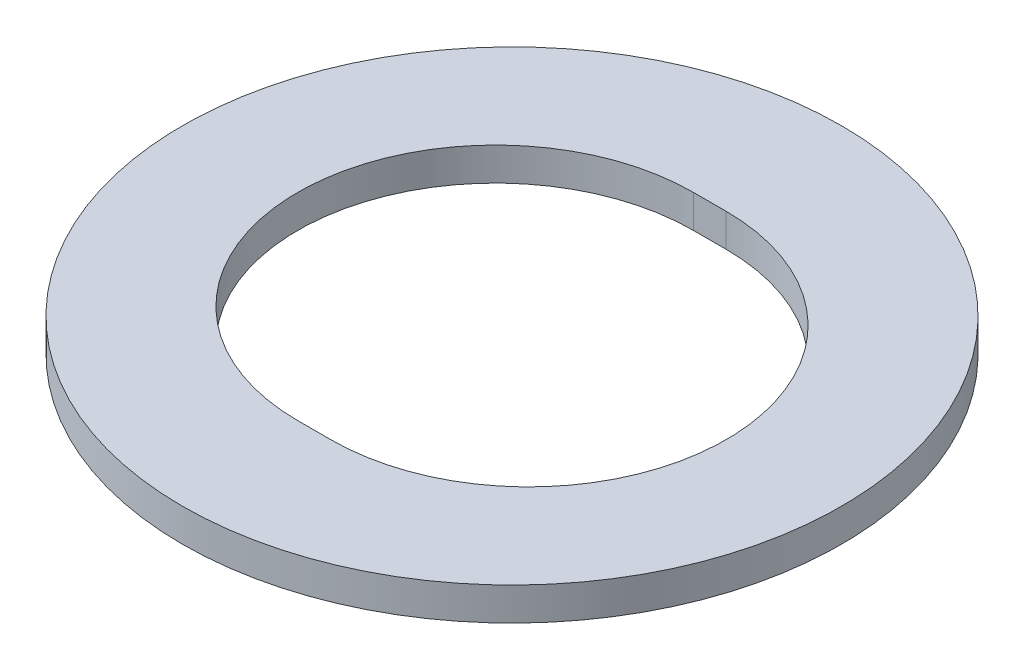
ISO-10303-21;
HEADER;
FILE_DESCRIPTION(('STEP AP214'),'2;1');
FILE_NAME('part.step','',(''),(''),'','','');
FILE_SCHEMA(('AUTOMOTIVE_DESIGN { 1 0 10303 214 1 1 1 1 }'));
ENDSEC;
DATA;
#1=APPLICATION_CONTEXT('core data for automotive mechanical design processes');
#2=APPLICATION_PROTOCOL_DEFINITION('international standard','automotive_design',2000,#1);
#3=PRODUCT_CONTEXT('',#1,'mechanical');
#4=PRODUCT('Part','Part','',(#3));
#5=PRODUCT_RELATED_PRODUCT_CATEGORY('part','',(#4));
#6=PRODUCT_DEFINITION_FORMATION('','',#4);
#7=PRODUCT_DEFINITION_CONTEXT('part definition',#1,'design');
#8=PRODUCT_DEFINITION('design','',#6,#7);
#9=PRODUCT_DEFINITION_SHAPE('','',#8);
#10=(LENGTH_UNIT() NAMED_UNIT(*) SI_UNIT(.MILLI.,.METRE.));
#11=(NAMED_UNIT(*) PLANE_ANGLE_UNIT() SI_UNIT($,.RADIAN.));
#12=(NAMED_UNIT(*) SI_UNIT($,.STERADIAN.) SOLID_ANGLE_UNIT());
#13=UNCERTAINTY_MEASURE_WITH_UNIT(LENGTH_MEASURE(1.E-05),#10,'distance_accuracy_value','');
#14=(GEOMETRIC_REPRESENTATION_CONTEXT(3) GLOBAL_UNCERTAINTY_ASSIGNED_CONTEXT((#13)) GLOBAL_UNIT_ASSIGNED_CONTEXT((#10,
#11,#12)) REPRESENTATION_CONTEXT('',''));
#15=CARTESIAN_POINT('',(0.,0.,0.));
#16=DIRECTION('',(0.,0.,1.));
#17=DIRECTION('',(1.,0.,0.));
#18=AXIS2_PLACEMENT_3D('',#15,#16,#17);
#19=CARTESIAN_POINT('',(0.,1.,0.));
#20=DIRECTION('',(0.,1.,0.));
#21=DIRECTION('',(0.,0.,1.));
#22=AXIS2_PLACEMENT_3D('',#19,#20,#21);
#23=PLANE('',#22);
#24=CARTESIAN_POINT('',(0.,1.,0.));
#25=DIRECTION('',(0.,1.,0.));
#26=DIRECTION('',(0.,0.,1.));
#27=AXIS2_PLACEMENT_3D('',#24,#25,#26);
#28=CIRCLE('',#27,10.);
#29=CARTESIAN_POINT('',(0.,1.,10.));
#30=VERTEX_POINT('',#29);
#31=EDGE_CURVE('E11',#30,#30,#28,.T.);
#32=ORIENTED_EDGE('',*,*,#31,.T.);
#33=EDGE_LOOP('',(#32));
#34=FACE_BOUND('',#33,.T.);
#35=DIRECTION('',(1.,0.,0.));
#36=VECTOR('',#35,1.);
#37=CARTESIAN_POINT('',(-0.5,1.,6.));
#38=LINE('',#37,#36);
#39=CARTESIAN_POINT('',(-0.5,1.,6.));
#40=VERTEX_POINT('',#39);
#41=CARTESIAN_POINT('',(0.500000000000002,1.,6.));
#42=VERTEX_POINT('',#41);
#43=EDGE_CURVE('E86',#40,#42,#38,.T.);
#44=ORIENTED_EDGE('',*,*,#43,.F.);
#45=CARTESIAN_POINT('',(-0.5,1.,0.));
#46=DIRECTION('',(0.,1.,0.));
#47=DIRECTION('',(0.,0.,1.));
#48=AXIS2_PLACEMENT_3D('',#45,#46,#47);
#49=CIRCLE('',#48,6.);
#50=CARTESIAN_POINT('',(-0.5,1.,-6.));
#51=VERTEX_POINT('',#50);
#52=EDGE_CURVE('E78',#51,#40,#49,.T.);
#53=ORIENTED_EDGE('',*,*,#52,.F.);
#54=DIRECTION('',(-1.,0.,0.));
#55=VECTOR('',#54,1.);
#56=CARTESIAN_POINT('',(-0.5,1.,-6.));
#57=LINE('',#56,#55);
#58=CARTESIAN_POINT('',(0.499999999999998,1.,-6.));
#59=VERTEX_POINT('',#58);
#60=EDGE_CURVE('E99',#59,#51,#57,.T.);
#61=ORIENTED_EDGE('',*,*,#60,.F.);
#62=CARTESIAN_POINT('',(0.5,1.,0.));
#63=DIRECTION('',(0.,1.,0.));
#64=DIRECTION('',(0.,0.,1.));
#65=AXIS2_PLACEMENT_3D('',#62,#63,#64);
#66=CIRCLE('',#65,6.);
#67=EDGE_CURVE('E97',#42,#59,#66,.T.);
#68=ORIENTED_EDGE('',*,*,#67,.F.);
#69=EDGE_LOOP('',(#44,#53,#61,#68));
#70=FACE_BOUND('',#69,.T.);
#71=ADVANCED_FACE('F37',(#34,#70),#23,.T.);
#72=CARTESIAN_POINT('',(0.,0.,0.));
#73=DIRECTION('',(0.,1.,0.));
#74=DIRECTION('',(0.,0.,1.));
#75=AXIS2_PLACEMENT_3D('',#72,#73,#74);
#76=PLANE('',#75);
#77=CARTESIAN_POINT('',(0.,0.,0.));
#78=DIRECTION('',(0.,1.,0.));
#79=DIRECTION('',(0.,0.,1.));
#80=AXIS2_PLACEMENT_3D('',#77,#78,#79);
#81=CIRCLE('',#80,10.);
#82=CARTESIAN_POINT('',(0.,0.,10.));
#83=VERTEX_POINT('',#82);
#84=EDGE_CURVE('E41',#83,#83,#81,.T.);
#85=ORIENTED_EDGE('',*,*,#84,.F.);
#86=EDGE_LOOP('',(#85));
#87=FACE_BOUND('',#86,.T.);
#88=CARTESIAN_POINT('',(-0.5,0.,0.));
#89=DIRECTION('',(0.,1.,0.));
#90=DIRECTION('',(0.,0.,1.));
#91=AXIS2_PLACEMENT_3D('',#88,#89,#90);
#92=CIRCLE('',#91,6.);
#93=CARTESIAN_POINT('',(-0.5,0.,-6.));
#94=VERTEX_POINT('',#93);
#95=CARTESIAN_POINT('',(-0.5,0.,6.));
#96=VERTEX_POINT('',#95);
#97=EDGE_CURVE('E60',#94,#96,#92,.T.);
#98=ORIENTED_EDGE('',*,*,#97,.T.);
#99=DIRECTION('',(1.,0.,0.));
#100=VECTOR('',#99,1.);
#101=CARTESIAN_POINT('',(-0.5,0.,6.));
#102=LINE('',#101,#100);
#103=CARTESIAN_POINT('',(0.500000000000002,0.,6.));
#104=VERTEX_POINT('',#103);
#105=EDGE_CURVE('E93',#96,#104,#102,.T.);
#106=ORIENTED_EDGE('',*,*,#105,.T.);
#107=CARTESIAN_POINT('',(0.5,0.,0.));
#108=DIRECTION('',(0.,1.,0.));
#109=DIRECTION('',(0.,0.,1.));
#110=AXIS2_PLACEMENT_3D('',#107,#108,#109);
#111=CIRCLE('',#110,6.);
#112=CARTESIAN_POINT('',(0.499999999999998,0.,-6.));
#113=VERTEX_POINT('',#112);
#114=EDGE_CURVE('E105',#104,#113,#111,.T.);
#115=ORIENTED_EDGE('',*,*,#114,.T.);
#116=DIRECTION('',(-1.,0.,0.));
#117=VECTOR('',#116,1.);
#118=CARTESIAN_POINT('',(-0.5,0.,-6.));
#119=LINE('',#118,#117);
#120=EDGE_CURVE('E87',#113,#94,#119,.T.);
#121=ORIENTED_EDGE('',*,*,#120,.T.);
#122=EDGE_LOOP('',(#98,#106,#115,#121));
#123=FACE_BOUND('',#122,.T.);
#124=ADVANCED_FACE('F116',(#87,#123),#76,.F.);
#125=CARTESIAN_POINT('',(0.,1.,0.));
#126=DIRECTION('',(0.,-1.,0.));
#127=DIRECTION('',(0.,0.,-1.));
#128=AXIS2_PLACEMENT_3D('',#125,#126,#127);
#129=CYLINDRICAL_SURFACE('',#128,10.);
#130=ORIENTED_EDGE('',*,*,#31,.F.);
#131=EDGE_LOOP('',(#130));
#132=FACE_BOUND('',#131,.T.);
#133=ORIENTED_EDGE('',*,*,#84,.T.);
#134=EDGE_LOOP('',(#133));
#135=FACE_BOUND('',#134,.T.);
#136=ADVANCED_FACE('F39',(#132,#135),#129,.T.);
#137=CARTESIAN_POINT('',(-0.5,1.,0.));
#138=DIRECTION('',(0.,-1.,0.));
#139=DIRECTION('',(0.,0.,-1.));
#140=AXIS2_PLACEMENT_3D('',#137,#138,#139);
#141=CYLINDRICAL_SURFACE('',#140,6.);
#142=ORIENTED_EDGE('',*,*,#97,.F.);
#143=DIRECTION('',(0.,-1.,0.));
#144=VECTOR('',#143,1.);
#145=CARTESIAN_POINT('',(-0.5,1.,-6.));
#146=LINE('',#145,#144);
#147=EDGE_CURVE('E82',#51,#94,#146,.T.);
#148=ORIENTED_EDGE('',*,*,#147,.F.);
#149=ORIENTED_EDGE('',*,*,#52,.T.);
#150=DIRECTION('',(0.,-1.,0.));
#151=VECTOR('',#150,1.);
#152=CARTESIAN_POINT('',(-0.5,1.,6.));
#153=LINE('',#152,#151);
#154=EDGE_CURVE('E81',#40,#96,#153,.T.);
#155=ORIENTED_EDGE('',*,*,#154,.T.);
#156=EDGE_LOOP('',(#142,#148,#149,#155));
#157=FACE_BOUND('',#156,.T.);
#158=ADVANCED_FACE('F80',(#157),#141,.F.);
#159=CARTESIAN_POINT('',(-0.5,1.,6.));
#160=DIRECTION('',(0.,0.,-1.));
#161=DIRECTION('',(-1.,0.,0.));
#162=AXIS2_PLACEMENT_3D('',#159,#160,#161);
#163=PLANE('',#162);
#164=ORIENTED_EDGE('',*,*,#105,.F.);
#165=ORIENTED_EDGE('',*,*,#154,.F.);
#166=ORIENTED_EDGE('',*,*,#43,.T.);
#167=DIRECTION('',(0.,-1.,0.));
#168=VECTOR('',#167,1.);
#169=CARTESIAN_POINT('',(0.500000000000002,1.,6.));
#170=LINE('',#169,#168);
#171=EDGE_CURVE('E94',#42,#104,#170,.T.);
#172=ORIENTED_EDGE('',*,*,#171,.T.);
#173=EDGE_LOOP('',(#164,#165,#166,#172));
#174=FACE_BOUND('',#173,.T.);
#175=ADVANCED_FACE('F90',(#174),#163,.T.);
#176=CARTESIAN_POINT('',(0.5,1.,0.));
#177=DIRECTION('',(0.,-1.,0.));
#178=DIRECTION('',(0.,0.,-1.));
#179=AXIS2_PLACEMENT_3D('',#176,#177,#178);
#180=CYLINDRICAL_SURFACE('',#179,6.);
#181=ORIENTED_EDGE('',*,*,#114,.F.);
#182=ORIENTED_EDGE('',*,*,#171,.F.);
#183=ORIENTED_EDGE('',*,*,#67,.T.);
#184=DIRECTION('',(0.,-1.,0.));
#185=VECTOR('',#184,1.);
#186=CARTESIAN_POINT('',(0.499999999999998,1.,-6.));
#187=LINE('',#186,#185);
#188=EDGE_CURVE('E52',#59,#113,#187,.T.);
#189=ORIENTED_EDGE('',*,*,#188,.T.);
#190=EDGE_LOOP('',(#181,#182,#183,#189));
#191=FACE_BOUND('',#190,.T.);
#192=ADVANCED_FACE('F114',(#191),#180,.F.);
#193=CARTESIAN_POINT('',(-0.5,1.,-6.));
#194=DIRECTION('',(0.,0.,1.));
#195=DIRECTION('',(1.,0.,0.));
#196=AXIS2_PLACEMENT_3D('',#193,#194,#195);
#197=PLANE('',#196);
#198=ORIENTED_EDGE('',*,*,#120,.F.);
#199=ORIENTED_EDGE('',*,*,#188,.F.);
#200=ORIENTED_EDGE('',*,*,#60,.T.);
#201=ORIENTED_EDGE('',*,*,#147,.T.);
#202=EDGE_LOOP('',(#198,#199,#200,#201));
#203=FACE_BOUND('',#202,.T.);
#204=ADVANCED_FACE('F117',(#203),#197,.T.);
#205=CLOSED_SHELL('',(#71,#124,#136,#158,#175,#192,#204));
#206=MANIFOLD_SOLID_BREP('B2',#205);
#207=ADVANCED_BREP_SHAPE_REPRESENTATION('',(#18,#206),#14);
#208=SHAPE_DEFINITION_REPRESENTATION(#9,#207);
ENDSEC;
END-ISO-10303-21;
